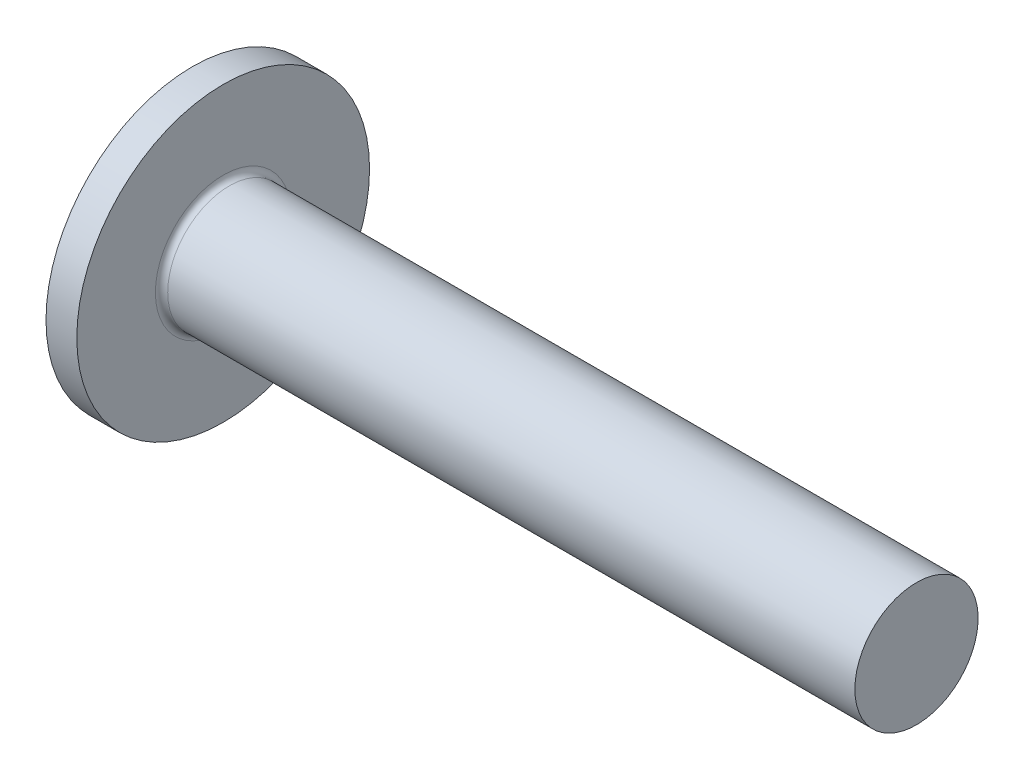
ISO-10303-21;
HEADER;
FILE_DESCRIPTION(('STEP AP214'),'2;1');
FILE_NAME('part.step','',(''),(''),'','','');
FILE_SCHEMA(('AUTOMOTIVE_DESIGN { 1 0 10303 214 1 1 1 1 }'));
ENDSEC;
DATA;
#1=APPLICATION_CONTEXT('core data for automotive mechanical design processes');
#2=APPLICATION_PROTOCOL_DEFINITION('international standard','automotive_design',2000,#1);
#3=PRODUCT_CONTEXT('',#1,'mechanical');
#4=PRODUCT('Part','Part','',(#3));
#5=PRODUCT_RELATED_PRODUCT_CATEGORY('part','',(#4));
#6=PRODUCT_DEFINITION_FORMATION('','',#4);
#7=PRODUCT_DEFINITION_CONTEXT('part definition',#1,'design');
#8=PRODUCT_DEFINITION('design','',#6,#7);
#9=PRODUCT_DEFINITION_SHAPE('','',#8);
#10=(LENGTH_UNIT() NAMED_UNIT(*) SI_UNIT(.MILLI.,.METRE.));
#11=(NAMED_UNIT(*) PLANE_ANGLE_UNIT() SI_UNIT($,.RADIAN.));
#12=(NAMED_UNIT(*) SI_UNIT($,.STERADIAN.) SOLID_ANGLE_UNIT());
#13=UNCERTAINTY_MEASURE_WITH_UNIT(LENGTH_MEASURE(1.E-05),#10,'distance_accuracy_value','');
#14=(GEOMETRIC_REPRESENTATION_CONTEXT(3) GLOBAL_UNCERTAINTY_ASSIGNED_CONTEXT((#13)) GLOBAL_UNIT_ASSIGNED_CONTEXT((#10,
#11,#12)) REPRESENTATION_CONTEXT('',''));
#15=CARTESIAN_POINT('',(0.,0.,0.));
#16=DIRECTION('',(0.,0.,1.));
#17=DIRECTION('',(1.,0.,0.));
#18=AXIS2_PLACEMENT_3D('',#15,#16,#17);
#19=CARTESIAN_POINT('',(4.52,-2.10652468209061,1.08));
#20=DIRECTION('',(0.,0.,1.));
#21=DIRECTION('',(1.,0.,0.));
#22=AXIS2_PLACEMENT_3D('',#19,#20,#21);
#23=PLANE('',#22);
#24=CARTESIAN_POINT('',(-3.42949548135467,-2.24578482291369,1.08));
#25=CARTESIAN_POINT('',(-2.74459757422525,-2.19263025216654,1.08));
#26=CARTESIAN_POINT('',(-2.05972501907199,-2.13914560063199,1.08));
#27=CARTESIAN_POINT('',(-0.690039772323025,-2.03129030940671,1.08));
#28=CARTESIAN_POINT('',(-0.00522708173474084,-1.97691965693136,1.08));
#29=CARTESIAN_POINT('',(1.36430916906305,-1.86706808550733,1.08));
#30=CARTESIAN_POINT('',(2.04903272931446,-1.81158716708237,1.08));
#31=CARTESIAN_POINT('',(3.07602359194152,-1.72726879416334,1.08));
#32=CARTESIAN_POINT('',(3.41833592845816,-1.69898002306805,1.08));
#33=CARTESIAN_POINT('',(4.10292649445159,-1.64197450899678,1.08));
#34=CARTESIAN_POINT('',(4.44520472376341,-1.61325776404309,1.08));
#35=CARTESIAN_POINT('',(5.50891408371535,-1.52324279017826,1.08));
#36=CARTESIAN_POINT('',(6.23027412879058,-1.46109632194497,1.08));
#37=CARTESIAN_POINT('',(7.31209654393642,-1.36548150018966,1.08));
#38=CARTESIAN_POINT('',(7.67266478712463,-1.33321098056209,1.08));
#39=CARTESIAN_POINT('',(8.39371198196685,-1.26767125361173,1.08));
#40=CARTESIAN_POINT('',(8.75419093330816,-1.23440204283998,1.08));
#41=CARTESIAN_POINT('',(9.47506187097177,-1.16659796049542,1.08));
#42=CARTESIAN_POINT('',(9.83545384698853,-1.13206297896843,1.08));
#43=CARTESIAN_POINT('',(10.5560726847527,-1.06134119052349,1.08));
#44=CARTESIAN_POINT('',(10.9162995480562,-1.02515439950972,1.08));
#45=CARTESIAN_POINT('',(11.6365460591403,-0.950537108981323,1.08));
#46=CARTESIAN_POINT('',(11.9965656924728,-0.912106468577752,1.08));
#47=CARTESIAN_POINT('',(12.536330571586,-0.852024599868948,1.08));
#48=CARTESIAN_POINT('',(12.7162110046236,-0.831590976075893,1.08));
#49=CARTESIAN_POINT('',(13.075853395867,-0.789691757116592,1.08));
#50=CARTESIAN_POINT('',(13.2556153527738,-0.768226150820763,1.08));
#51=CARTESIAN_POINT('',(13.4353019596236,-0.746134687566356,1.08));
#52=B_SPLINE_CURVE_WITH_KNOTS('',3,(#24,#25,#26,#27,#28,#29,#30,#31,#32,#33,#34,#35,#36,#37,#38,
#39,#40,#41,#42,#43,#44,#45,#46,#47,#48,#49,#50,#51),.UNSPECIFIED.,.F.,.F.,(4,2,2,2,2,2,2,2,2,2,
2,2,2,4),(0.,2.06087268026439,4.12177512442803,6.18267659645409,7.21311405722568,
8.24355628122954,10.4156465560909,11.5016738987954,12.5877049925156,13.673830651548,
14.7599458552026,15.8461293283809,16.3892386009247,16.9323537320328),.UNSPECIFIED.);
#53=CARTESIAN_POINT('',(4.52,-1.60687912990707,1.08));
#54=VERTEX_POINT('',#53);
#55=CARTESIAN_POINT('',(0.229677597310556,-1.95799778910139,1.08));
#56=VERTEX_POINT('',#55);
#57=EDGE_CURVE('E332',#54,#56,#52,.F.);
#58=ORIENTED_EDGE('',*,*,#57,.F.);
#59=DIRECTION('',(0.,1.,0.));
#60=VECTOR('',#59,1.);
#61=CARTESIAN_POINT('',(4.52,-2.10652468209061,1.08));
#62=LINE('',#61,#60);
#63=CARTESIAN_POINT('',(4.52,-2.10652468209061,1.08));
#64=VERTEX_POINT('',#63);
#65=EDGE_CURVE('E291',#64,#54,#62,.T.);
#66=ORIENTED_EDGE('',*,*,#65,.F.);
#67=DIRECTION('',(0.891769790724579,0.452489381478771,0.));
#68=VECTOR('',#67,1.);
#69=CARTESIAN_POINT('',(0.,-4.4,1.08));
#70=LINE('',#69,#68);
#71=CARTESIAN_POINT('',(0.806505873038805,-3.9907740456718,1.08));
#72=VERTEX_POINT('',#71);
#73=EDGE_CURVE('E277',#72,#64,#70,.T.);
#74=ORIENTED_EDGE('',*,*,#73,.F.);
#75=CARTESIAN_POINT('',(11.,0.,1.08));
#76=DIRECTION('',(0.,0.,1.));
#77=DIRECTION('',(1.,0.,0.));
#78=AXIS2_PLACEMENT_3D('',#75,#76,#77);
#79=CIRCLE('',#78,10.9468534291823);
#80=EDGE_CURVE('E214',#56,#72,#79,.T.);
#81=ORIENTED_EDGE('',*,*,#80,.F.);
#82=EDGE_LOOP('',(#58,#66,#74,#81));
#83=FACE_BOUND('',#82,.T.);
#84=ADVANCED_FACE('F39',(#83),#23,.F.);
#85=CARTESIAN_POINT('',(4.52,2.106524682091,-1.08));
#86=DIRECTION('',(0.,0.,-1.));
#87=DIRECTION('',(0.,1.,0.));
#88=AXIS2_PLACEMENT_3D('',#85,#86,#87);
#89=PLANE('',#88);
#90=CARTESIAN_POINT('',(-3.42949548898096,-2.24578482350543,-1.08));
#91=CARTESIAN_POINT('',(-2.74459758090029,-2.19263025268705,-1.08));
#92=CARTESIAN_POINT('',(-2.05972502479582,-2.13914560108067,-1.08));
#93=CARTESIAN_POINT('',(-0.690039776144523,-2.03129030970972,-1.08));
#94=CARTESIAN_POINT('',(-0.00522708460510993,-1.97691965716053,-1.08));
#95=CARTESIAN_POINT('',(1.36430916876932,-1.86706808553195,-1.08));
#96=CARTESIAN_POINT('',(2.04903273064614,-1.81158716697517,-1.08));
#97=CARTESIAN_POINT('',(3.07602359571083,-1.7272687938528,-1.08));
#98=CARTESIAN_POINT('',(3.41833593303991,-1.69898002268879,-1.08));
#99=CARTESIAN_POINT('',(4.10292650065803,-1.64197450847772,-1.08));
#100=CARTESIAN_POINT('',(4.44520473078209,-1.61325776345294,-1.08));
#101=CARTESIAN_POINT('',(5.50891409154568,-1.5232427895075,-1.08));
#102=CARTESIAN_POINT('',(6.23027413662032,-1.4610963212648,-1.08));
#103=CARTESIAN_POINT('',(7.31209655176489,-1.36548149949189,-1.08));
#104=CARTESIAN_POINT('',(7.67266479495259,-1.33321097985786,-1.08));
#105=CARTESIAN_POINT('',(8.39371198979364,-1.26767125289298,-1.08));
#106=CARTESIAN_POINT('',(8.75419094113428,-1.23440204211315,-1.08));
#107=CARTESIAN_POINT('',(9.47506187879645,-1.16659795975014,-1.08));
#108=CARTESIAN_POINT('',(9.83545385481244,-1.13206297821277,-1.08));
#109=CARTESIAN_POINT('',(10.5560726925747,-1.06134118974365,-1.08));
#110=CARTESIAN_POINT('',(10.916299555877,-1.02515439871608,-1.08));
#111=CARTESIAN_POINT('',(11.6365460669582,-0.950537108154692,-1.08));
#112=CARTESIAN_POINT('',(11.996565700289,-0.91210646773193,-1.08));
#113=CARTESIAN_POINT('',(12.5363305793987,-0.852024598987238,-1.08));
#114=CARTESIAN_POINT('',(12.716211012435,-0.831590975181036,-1.08));
#115=CARTESIAN_POINT('',(13.0758534036753,-0.789691756191974,-1.08));
#116=CARTESIAN_POINT('',(13.2556153605804,-0.768226149879534,-1.08));
#117=CARTESIAN_POINT('',(13.4353019674281,-0.746134686606234,-1.08));
#118=B_SPLINE_CURVE_WITH_KNOTS('',3,(#90,#91,#92,#93,#94,#95,#96,#97,#98,#99,#100,#101,#102,
#103,#104,#105,#106,#107,#108,#109,#110,#111,#112,#113,#114,#115,#116,#117),.UNSPECIFIED.,.F.,
.F.,(4,2,2,2,2,2,2,2,2,2,2,2,2,4),(0.,2.06087268312612,4.12177513015173,6.18267660707004,
7.21311407028764,8.24355629673754,10.4156465715995,11.5016739143043,12.5877050080247,
13.6738306670577,14.759945870713,15.8461293438922,16.3892386164365,16.9323537475453),.UNSPECIFIED.);
#119=CARTESIAN_POINT('',(0.229677597310245,-1.95799778910142,-1.08));
#120=VERTEX_POINT('',#119);
#121=CARTESIAN_POINT('',(4.52,-1.60687912990707,-1.08));
#122=VERTEX_POINT('',#121);
#123=EDGE_CURVE('E324',#120,#122,#118,.T.);
#124=ORIENTED_EDGE('',*,*,#123,.F.);
#125=CARTESIAN_POINT('',(11.,0.,-1.08));
#126=DIRECTION('',(0.,0.,-1.));
#127=DIRECTION('',(0.,1.,0.));
#128=AXIS2_PLACEMENT_3D('',#125,#126,#127);
#129=CIRCLE('',#128,10.9468534291823);
#130=CARTESIAN_POINT('',(0.806505873038805,-3.9907740456718,-1.08));
#131=VERTEX_POINT('',#130);
#132=EDGE_CURVE('E219',#131,#120,#129,.T.);
#133=ORIENTED_EDGE('',*,*,#132,.F.);
#134=DIRECTION('',(0.891769790724579,0.452489381478771,0.));
#135=VECTOR('',#134,1.);
#136=CARTESIAN_POINT('',(0.,-4.4,-1.08));
#137=LINE('',#136,#135);
#138=CARTESIAN_POINT('',(4.52,-2.10652468209061,-1.08));
#139=VERTEX_POINT('',#138);
#140=EDGE_CURVE('E280',#131,#139,#137,.T.);
#141=ORIENTED_EDGE('',*,*,#140,.T.);
#142=DIRECTION('',(0.,-1.,0.));
#143=VECTOR('',#142,1.);
#144=CARTESIAN_POINT('',(4.52,2.106524682091,-1.08));
#145=LINE('',#144,#143);
#146=EDGE_CURVE('E290',#122,#139,#145,.T.);
#147=ORIENTED_EDGE('',*,*,#146,.F.);
#148=EDGE_LOOP('',(#124,#133,#141,#147));
#149=FACE_BOUND('',#148,.T.);
#150=ADVANCED_FACE('F172',(#149),#89,.F.);
#151=CARTESIAN_POINT('',(11.,0.,0.));
#152=DIRECTION('',(-1.,0.,0.));
#153=DIRECTION('',(0.,1.,0.));
#154=AXIS2_PLACEMENT_3D('',#151,#152,#153);
#155=SPHERICAL_SURFACE('',#154,11.);
#156=CARTESIAN_POINT('',(3.9,0.,0.));
#157=DIRECTION('',(1.,0.,0.));
#158=DIRECTION('',(0.,0.,-1.));
#159=AXIS2_PLACEMENT_3D('',#156,#157,#158);
#160=CIRCLE('',#159,8.40178552451799);
#161=CARTESIAN_POINT('',(3.9,0.,-8.40178552451799));
#162=VERTEX_POINT('',#161);
#163=EDGE_CURVE('E313',#162,#162,#160,.F.);
#164=ORIENTED_EDGE('',*,*,#163,.T.);
#165=EDGE_LOOP('',(#164));
#166=FACE_BOUND('',#165,.T.);
#167=CARTESIAN_POINT('',(0.229677597310556,0.,0.));
#168=DIRECTION('',(1.,0.,0.));
#169=DIRECTION('',(0.,0.,-1.));
#170=AXIS2_PLACEMENT_3D('',#167,#168,#169);
#171=CIRCLE('',#170,2.23610271278534);
#172=CARTESIAN_POINT('',(0.229677597310556,-1.07999999999999,-1.95799778910139));
#173=VERTEX_POINT('',#172);
#174=EDGE_CURVE('E318',#173,#120,#171,.F.);
#175=ORIENTED_EDGE('',*,*,#174,.F.);
#176=CARTESIAN_POINT('',(11.,-1.08,0.));
#177=DIRECTION('',(0.,-1.,0.));
#178=DIRECTION('',(0.,0.,-1.));
#179=AXIS2_PLACEMENT_3D('',#176,#177,#178);
#180=CIRCLE('',#179,10.9468534291823);
#181=CARTESIAN_POINT('',(0.806505873038805,-1.07999999999999,-3.9907740456718));
#182=VERTEX_POINT('',#181);
#183=EDGE_CURVE('E230',#173,#182,#180,.T.);
#184=ORIENTED_EDGE('',*,*,#183,.T.);
#185=CARTESIAN_POINT('',(10.5232589446548,0.,0.939565188835178));
#186=DIRECTION('',(0.452489381478771,0.,-0.891769790724579));
#187=DIRECTION('',(-0.891769790724579,0.,-0.452489381478771));
#188=AXIS2_PLACEMENT_3D('',#185,#186,#187);
#189=CIRCLE('',#188,10.9494262508169);
#190=CARTESIAN_POINT('',(0.806505873038805,1.08000000000001,-3.9907740456718));
#191=VERTEX_POINT('',#190);
#192=EDGE_CURVE('E53',#182,#191,#189,.T.);
#193=ORIENTED_EDGE('',*,*,#192,.T.);
#194=CARTESIAN_POINT('',(11.,1.08,0.));
#195=DIRECTION('',(0.,1.,0.));
#196=DIRECTION('',(0.,0.,1.));
#197=AXIS2_PLACEMENT_3D('',#194,#195,#196);
#198=CIRCLE('',#197,10.9468534291823);
#199=CARTESIAN_POINT('',(0.229677597310556,1.08000000000001,-1.95799778910138));
#200=VERTEX_POINT('',#199);
#201=EDGE_CURVE('E228',#191,#200,#198,.T.);
#202=ORIENTED_EDGE('',*,*,#201,.T.);
#203=CARTESIAN_POINT('',(0.229677597310559,1.9579977891014,-1.08));
#204=VERTEX_POINT('',#203);
#205=EDGE_CURVE('E339',#204,#200,#171,.F.);
#206=ORIENTED_EDGE('',*,*,#205,.F.);
#207=CARTESIAN_POINT('',(0.806505873038829,3.99077404567186,-1.08));
#208=VERTEX_POINT('',#207);
#209=EDGE_CURVE('E315',#204,#208,#129,.T.);
#210=ORIENTED_EDGE('',*,*,#209,.T.);
#211=CARTESIAN_POINT('',(10.5232589446552,-0.939565188834484,0.));
#212=DIRECTION('',(0.45248938147871,0.89176979072461,0.));
#213=DIRECTION('',(-0.89176979072461,0.45248938147871,0.));
#214=AXIS2_PLACEMENT_3D('',#211,#212,#213);
#215=CIRCLE('',#214,10.9494262508169);
#216=CARTESIAN_POINT('',(0.806505873038829,3.99077404567186,1.08));
#217=VERTEX_POINT('',#216);
#218=EDGE_CURVE('E212',#208,#217,#215,.T.);
#219=ORIENTED_EDGE('',*,*,#218,.T.);
#220=CARTESIAN_POINT('',(0.229677597310556,1.95799778910139,1.08));
#221=VERTEX_POINT('',#220);
#222=EDGE_CURVE('E200',#217,#221,#79,.T.);
#223=ORIENTED_EDGE('',*,*,#222,.T.);
#224=CARTESIAN_POINT('',(0.229677597310559,1.07999999999999,1.9579977891014));
#225=VERTEX_POINT('',#224);
#226=EDGE_CURVE('E210',#225,#221,#171,.F.);
#227=ORIENTED_EDGE('',*,*,#226,.F.);
#228=CARTESIAN_POINT('',(0.806505873038829,1.07999999999999,3.99077404567186));
#229=VERTEX_POINT('',#228);
#230=EDGE_CURVE('E247',#225,#229,#198,.T.);
#231=ORIENTED_EDGE('',*,*,#230,.T.);
#232=CARTESIAN_POINT('',(10.5232589446552,0.,-0.939565188834484));
#233=DIRECTION('',(0.45248938147871,0.,0.89176979072461));
#234=DIRECTION('',(0.89176979072461,0.,-0.45248938147871));
#235=AXIS2_PLACEMENT_3D('',#232,#233,#234);
#236=CIRCLE('',#235,10.9494262508169);
#237=CARTESIAN_POINT('',(0.806505873038829,-1.08000000000001,3.99077404567185));
#238=VERTEX_POINT('',#237);
#239=EDGE_CURVE('E217',#229,#238,#236,.T.);
#240=ORIENTED_EDGE('',*,*,#239,.T.);
#241=CARTESIAN_POINT('',(0.229677597310245,-1.08000000000001,1.95799778910142));
#242=VERTEX_POINT('',#241);
#243=EDGE_CURVE('E276',#238,#242,#180,.T.);
#244=ORIENTED_EDGE('',*,*,#243,.T.);
#245=EDGE_CURVE('E204',#56,#242,#171,.F.);
#246=ORIENTED_EDGE('',*,*,#245,.F.);
#247=ORIENTED_EDGE('',*,*,#80,.T.);
#248=CARTESIAN_POINT('',(10.5232589446548,0.939565188835178,0.));
#249=DIRECTION('',(0.452489381478771,-0.891769790724579,0.));
#250=DIRECTION('',(0.891769790724579,0.452489381478771,0.));
#251=AXIS2_PLACEMENT_3D('',#248,#249,#250);
#252=CIRCLE('',#251,10.9494262508169);
#253=EDGE_CURVE('E213',#72,#131,#252,.T.);
#254=ORIENTED_EDGE('',*,*,#253,.T.);
#255=ORIENTED_EDGE('',*,*,#132,.T.);
#256=EDGE_LOOP('',(#175,#184,#193,#202,#206,#210,#219,#223,#227,#231,#240,#244,#246,#247,#254,#255));
#257=FACE_BOUND('',#256,.T.);
#258=ADVANCED_FACE('F179',(#166,#257),#155,.T.);
#259=CARTESIAN_POINT('',(-3.42949548135467,2.24578482291369,1.08));
#260=CARTESIAN_POINT('',(-2.74459757422525,2.19263025216654,1.08));
#261=CARTESIAN_POINT('',(-2.05972501907199,2.13914560063199,1.08));
#262=CARTESIAN_POINT('',(-0.690039772323024,2.03129030940671,1.08));
#263=CARTESIAN_POINT('',(-0.0052270817347403,1.97691965693136,1.08));
#264=CARTESIAN_POINT('',(1.36430916906305,1.86706808550733,1.08));
#265=CARTESIAN_POINT('',(2.04903272931446,1.81158716708237,1.08));
#266=CARTESIAN_POINT('',(3.07602359194152,1.72726879416334,1.08));
#267=CARTESIAN_POINT('',(3.41833592845816,1.69898002306805,1.08));
#268=CARTESIAN_POINT('',(4.10292649445159,1.64197450899678,1.08));
#269=CARTESIAN_POINT('',(4.44520472376341,1.61325776404309,1.08));
#270=CARTESIAN_POINT('',(5.50891408371535,1.52324279017826,1.08));
#271=CARTESIAN_POINT('',(6.23027412879058,1.46109632194497,1.08));
#272=CARTESIAN_POINT('',(7.31209654393642,1.36548150018966,1.08));
#273=CARTESIAN_POINT('',(7.67266478712463,1.33321098056209,1.08));
#274=CARTESIAN_POINT('',(8.39371198196685,1.26767125361173,1.08));
#275=CARTESIAN_POINT('',(8.75419093330816,1.23440204283998,1.08));
#276=CARTESIAN_POINT('',(9.47506187097177,1.16659796049542,1.08));
#277=CARTESIAN_POINT('',(9.83545384698853,1.13206297896843,1.08));
#278=CARTESIAN_POINT('',(10.5560726847527,1.06134119052349,1.08));
#279=CARTESIAN_POINT('',(10.9162995480562,1.02515439950972,1.08));
#280=CARTESIAN_POINT('',(11.6365460591403,0.950537108981323,1.08));
#281=CARTESIAN_POINT('',(11.9965656924729,0.912106468577753,1.08));
#282=CARTESIAN_POINT('',(12.536330571586,0.852024599868948,1.08));
#283=CARTESIAN_POINT('',(12.7162110046236,0.831590976075893,1.08));
#284=CARTESIAN_POINT('',(13.075853395867,0.789691757116591,1.08));
#285=CARTESIAN_POINT('',(13.2556153527738,0.768226150820763,1.08));
#286=CARTESIAN_POINT('',(13.4353019596236,0.746134687566355,1.08));
#287=B_SPLINE_CURVE_WITH_KNOTS('',3,(#259,#260,#261,#262,#263,#264,#265,#266,#267,#268,#269,
#270,#271,#272,#273,#274,#275,#276,#277,#278,#279,#280,#281,#282,#283,#284,#285,#286),
.UNSPECIFIED.,.F.,.F.,(4,2,2,2,2,2,2,2,2,2,2,2,2,4),(0.,2.06087268026439,4.12177512442803,
6.18267659645409,7.21311405722568,8.24355628122954,10.4156465560909,11.5016738987954,
12.5877049925156,13.673830651548,14.7599458552026,15.8461293283809,16.3892386009247,
16.9323537320328),.UNSPECIFIED.);
#288=CARTESIAN_POINT('',(4.52,1.60687912990707,1.08));
#289=VERTEX_POINT('',#288);
#290=EDGE_CURVE('E198',#221,#289,#287,.T.);
#291=ORIENTED_EDGE('',*,*,#290,.F.);
#292=ORIENTED_EDGE('',*,*,#222,.F.);
#293=DIRECTION('',(0.89176979072461,-0.45248938147871,0.));
#294=VECTOR('',#293,1.);
#295=CARTESIAN_POINT('',(0.,4.4,1.08));
#296=LINE('',#295,#294);
#297=CARTESIAN_POINT('',(4.52,2.106524682091,1.08));
#298=VERTEX_POINT('',#297);
#299=EDGE_CURVE('E67',#217,#298,#296,.T.);
#300=ORIENTED_EDGE('',*,*,#299,.T.);
#301=EDGE_CURVE('E202',#289,#298,#62,.T.);
#302=ORIENTED_EDGE('',*,*,#301,.F.);
#303=EDGE_LOOP('',(#291,#292,#300,#302));
#304=FACE_BOUND('',#303,.T.);
#305=ADVANCED_FACE('F175',(#304),#23,.F.);
#306=CARTESIAN_POINT('',(-3.42949548898096,2.24578482350543,-1.08));
#307=CARTESIAN_POINT('',(-2.74459758090029,2.19263025268706,-1.08));
#308=CARTESIAN_POINT('',(-2.05972502479582,2.13914560108067,-1.08));
#309=CARTESIAN_POINT('',(-0.690039776144522,2.03129030970972,-1.08));
#310=CARTESIAN_POINT('',(-0.00522708460510939,1.97691965716054,-1.08));
#311=CARTESIAN_POINT('',(1.36430916876932,1.86706808553195,-1.08));
#312=CARTESIAN_POINT('',(2.04903273064614,1.81158716697518,-1.08));
#313=CARTESIAN_POINT('',(3.07602359571083,1.7272687938528,-1.08));
#314=CARTESIAN_POINT('',(3.41833593303991,1.69898002268879,-1.08));
#315=CARTESIAN_POINT('',(4.10292650065803,1.64197450847772,-1.08));
#316=CARTESIAN_POINT('',(4.4452047307821,1.61325776345294,-1.08));
#317=CARTESIAN_POINT('',(5.50891409154568,1.5232427895075,-1.08));
#318=CARTESIAN_POINT('',(6.23027413662032,1.4610963212648,-1.08));
#319=CARTESIAN_POINT('',(7.31209655176489,1.36548149949189,-1.08));
#320=CARTESIAN_POINT('',(7.67266479495259,1.33321097985786,-1.08));
#321=CARTESIAN_POINT('',(8.39371198979364,1.26767125289298,-1.08));
#322=CARTESIAN_POINT('',(8.75419094113429,1.23440204211315,-1.08));
#323=CARTESIAN_POINT('',(9.47506187879645,1.16659795975014,-1.08));
#324=CARTESIAN_POINT('',(9.83545385481244,1.13206297821277,-1.08));
#325=CARTESIAN_POINT('',(10.5560726925747,1.06134118974365,-1.08));
#326=CARTESIAN_POINT('',(10.916299555877,1.02515439871608,-1.08));
#327=CARTESIAN_POINT('',(11.6365460669582,0.950537108154692,-1.08));
#328=CARTESIAN_POINT('',(11.996565700289,0.91210646773193,-1.08));
#329=CARTESIAN_POINT('',(12.5363305793987,0.852024598987239,-1.08));
#330=CARTESIAN_POINT('',(12.716211012435,0.831590975181037,-1.08));
#331=CARTESIAN_POINT('',(13.0758534036753,0.789691756191976,-1.08));
#332=CARTESIAN_POINT('',(13.2556153605804,0.768226149879535,-1.08));
#333=CARTESIAN_POINT('',(13.4353019674281,0.746134686606234,-1.08));
#334=B_SPLINE_CURVE_WITH_KNOTS('',3,(#306,#307,#308,#309,#310,#311,#312,#313,#314,#315,#316,
#317,#318,#319,#320,#321,#322,#323,#324,#325,#326,#327,#328,#329,#330,#331,#332,#333),
.UNSPECIFIED.,.F.,.F.,(4,2,2,2,2,2,2,2,2,2,2,2,2,4),(0.,2.06087268312612,4.12177513015173,
6.18267660707004,7.21311407028764,8.24355629673754,10.4156465715996,11.5016739143043,
12.5877050080247,13.6738306670577,14.759945870713,15.8461293438922,16.3892386164365,
16.9323537475453),.UNSPECIFIED.);
#335=CARTESIAN_POINT('',(4.52,1.60687912990707,-1.08));
#336=VERTEX_POINT('',#335);
#337=EDGE_CURVE('E350',#336,#204,#334,.F.);
#338=ORIENTED_EDGE('',*,*,#337,.F.);
#339=CARTESIAN_POINT('',(4.52,2.106524682091,-1.08));
#340=VERTEX_POINT('',#339);
#341=EDGE_CURVE('E292',#340,#336,#145,.T.);
#342=ORIENTED_EDGE('',*,*,#341,.F.);
#343=DIRECTION('',(0.89176979072461,-0.45248938147871,0.));
#344=VECTOR('',#343,1.);
#345=CARTESIAN_POINT('',(0.,4.4,-1.08));
#346=LINE('',#345,#344);
#347=EDGE_CURVE('E284',#208,#340,#346,.T.);
#348=ORIENTED_EDGE('',*,*,#347,.F.);
#349=ORIENTED_EDGE('',*,*,#209,.F.);
#350=EDGE_LOOP('',(#338,#342,#348,#349));
#351=FACE_BOUND('',#350,.T.);
#352=ADVANCED_FACE('F182',(#351),#89,.F.);
#353=CARTESIAN_POINT('',(4.52,2.106524682091,1.08));
#354=DIRECTION('',(-1.,0.,0.));
#355=DIRECTION('',(0.,0.,1.));
#356=AXIS2_PLACEMENT_3D('',#353,#354,#355);
#357=PLANE('',#356);
#358=ORIENTED_EDGE('',*,*,#65,.T.);
#359=CARTESIAN_POINT('',(4.52,0.,0.));
#360=DIRECTION('',(-1.,0.,0.));
#361=DIRECTION('',(0.,0.,1.));
#362=AXIS2_PLACEMENT_3D('',#359,#360,#361);
#363=CIRCLE('',#362,1.93609414495548);
#364=EDGE_CURVE('E336',#54,#122,#363,.F.);
#365=ORIENTED_EDGE('',*,*,#364,.T.);
#366=ORIENTED_EDGE('',*,*,#146,.T.);
#367=DIRECTION('',(0.,0.,1.));
#368=VECTOR('',#367,1.);
#369=CARTESIAN_POINT('',(4.52,-2.10652468209061,-1.08));
#370=LINE('',#369,#368);
#371=EDGE_CURVE('E286',#139,#64,#370,.T.);
#372=ORIENTED_EDGE('',*,*,#371,.T.);
#373=EDGE_LOOP('',(#358,#365,#366,#372));
#374=FACE_BOUND('',#373,.T.);
#375=ADVANCED_FACE('F192',(#374),#357,.T.);
#376=DIRECTION('',(0.,0.,1.));
#377=VECTOR('',#376,1.);
#378=CARTESIAN_POINT('',(4.52,-1.07999999999999,-2.10652468209061));
#379=LINE('',#378,#377);
#380=CARTESIAN_POINT('',(4.52,-1.07999999999999,-2.10652468209061));
#381=VERTEX_POINT('',#380);
#382=CARTESIAN_POINT('',(4.52,-1.07999999999999,-1.60687912990707));
#383=VERTEX_POINT('',#382);
#384=EDGE_CURVE('E245',#381,#383,#379,.T.);
#385=ORIENTED_EDGE('',*,*,#384,.T.);
#386=CARTESIAN_POINT('',(4.52,1.08000000000001,-1.60687912990706));
#387=VERTEX_POINT('',#386);
#388=EDGE_CURVE('E378',#383,#387,#363,.F.);
#389=ORIENTED_EDGE('',*,*,#388,.T.);
#390=DIRECTION('',(0.,0.,-1.));
#391=VECTOR('',#390,1.);
#392=CARTESIAN_POINT('',(4.52,1.07999999999999,2.106524682091));
#393=LINE('',#392,#391);
#394=CARTESIAN_POINT('',(4.52,1.08000000000001,-2.1065246820906));
#395=VERTEX_POINT('',#394);
#396=EDGE_CURVE('E268',#387,#395,#393,.T.);
#397=ORIENTED_EDGE('',*,*,#396,.T.);
#398=DIRECTION('',(0.,-1.,0.));
#399=VECTOR('',#398,1.);
#400=CARTESIAN_POINT('',(4.52,1.08000000000001,-2.1065246820906));
#401=LINE('',#400,#399);
#402=EDGE_CURVE('E264',#395,#381,#401,.T.);
#403=ORIENTED_EDGE('',*,*,#402,.T.);
#404=EDGE_LOOP('',(#385,#389,#397,#403));
#405=FACE_BOUND('',#404,.T.);
#406=ADVANCED_FACE('F459',(#405),#357,.T.);
#407=ORIENTED_EDGE('',*,*,#341,.T.);
#408=EDGE_CURVE('E334',#336,#289,#363,.F.);
#409=ORIENTED_EDGE('',*,*,#408,.T.);
#410=ORIENTED_EDGE('',*,*,#301,.T.);
#411=DIRECTION('',(0.,0.,-1.));
#412=VECTOR('',#411,1.);
#413=CARTESIAN_POINT('',(4.52,2.106524682091,1.08));
#414=LINE('',#413,#412);
#415=EDGE_CURVE('E287',#298,#340,#414,.T.);
#416=ORIENTED_EDGE('',*,*,#415,.T.);
#417=EDGE_LOOP('',(#407,#409,#410,#416));
#418=FACE_BOUND('',#417,.T.);
#419=ADVANCED_FACE('F383',(#418),#357,.T.);
#420=CARTESIAN_POINT('',(4.52,1.07999999999999,2.106524682091));
#421=DIRECTION('',(0.,1.,0.));
#422=DIRECTION('',(0.,0.,1.));
#423=AXIS2_PLACEMENT_3D('',#420,#421,#422);
#424=PLANE('',#423);
#425=CARTESIAN_POINT('',(-3.42949548898096,1.08000000000001,-2.24578482350543));
#426=CARTESIAN_POINT('',(-2.74459758090029,1.08000000000001,-2.19263025268705));
#427=CARTESIAN_POINT('',(-2.05972502479583,1.08000000000001,-2.13914560108066));
#428=CARTESIAN_POINT('',(-0.690039776144523,1.08000000000001,-2.03129030970971));
#429=CARTESIAN_POINT('',(-0.00522708460511025,1.08000000000001,-1.97691965716053));
#430=CARTESIAN_POINT('',(1.36430916876932,1.08000000000001,-1.86706808553194));
#431=CARTESIAN_POINT('',(2.04903273064614,1.08000000000001,-1.81158716697517));
#432=CARTESIAN_POINT('',(3.07602359571083,1.08000000000001,-1.72726879385279));
#433=CARTESIAN_POINT('',(3.41833593303991,1.08000000000001,-1.69898002268879));
#434=CARTESIAN_POINT('',(4.10292650065803,1.08000000000001,-1.64197450847772));
#435=CARTESIAN_POINT('',(4.44520473078209,1.08000000000001,-1.61325776345294));
#436=CARTESIAN_POINT('',(5.50891409154568,1.08000000000001,-1.52324278950749));
#437=CARTESIAN_POINT('',(6.23027413662032,1.08000000000001,-1.4610963212648));
#438=CARTESIAN_POINT('',(7.31209655176489,1.08000000000001,-1.36548149949188));
#439=CARTESIAN_POINT('',(7.67266479495259,1.08000000000001,-1.33321097985786));
#440=CARTESIAN_POINT('',(8.39371198979364,1.08,-1.26767125289298));
#441=CARTESIAN_POINT('',(8.75419094113429,1.08,-1.23440204211315));
#442=CARTESIAN_POINT('',(9.47506187879645,1.08,-1.16659795975014));
#443=CARTESIAN_POINT('',(9.83545385481244,1.08,-1.13206297821276));
#444=CARTESIAN_POINT('',(10.5560726925747,1.08,-1.06134118974364));
#445=CARTESIAN_POINT('',(10.916299555877,1.08,-1.02515439871607));
#446=CARTESIAN_POINT('',(11.6365460669582,1.08,-0.950537108154688));
#447=CARTESIAN_POINT('',(11.996565700289,1.08,-0.912106467731926));
#448=CARTESIAN_POINT('',(12.5363305793987,1.08,-0.852024598987235));
#449=CARTESIAN_POINT('',(12.716211012435,1.08,-0.831590975181032));
#450=CARTESIAN_POINT('',(13.0758534036753,1.08,-0.789691756191971));
#451=CARTESIAN_POINT('',(13.2556153605804,1.08,-0.76822614987953));
#452=CARTESIAN_POINT('',(13.4353019674281,1.08,-0.74613468660623));
#453=B_SPLINE_CURVE_WITH_KNOTS('',3,(#425,#426,#427,#428,#429,#430,#431,#432,#433,#434,#435,
#436,#437,#438,#439,#440,#441,#442,#443,#444,#445,#446,#447,#448,#449,#450,#451,#452),
.UNSPECIFIED.,.F.,.F.,(4,2,2,2,2,2,2,2,2,2,2,2,2,4),(0.,2.06087268312612,4.12177513015173,
6.18267660707004,7.21311407028764,8.24355629673754,10.4156465715996,11.5016739143043,
12.5877050080247,13.6738306670577,14.759945870713,15.8461293438922,16.3892386164365,
16.9323537475453),.UNSPECIFIED.);
#454=EDGE_CURVE('E373',#200,#387,#453,.T.);
#455=ORIENTED_EDGE('',*,*,#454,.F.);
#456=ORIENTED_EDGE('',*,*,#201,.F.);
#457=DIRECTION('',(0.891769790724579,0.,0.452489381478771));
#458=VECTOR('',#457,1.);
#459=CARTESIAN_POINT('',(0.,1.08000000000002,-4.4));
#460=LINE('',#459,#458);
#461=EDGE_CURVE('E239',#191,#395,#460,.T.);
#462=ORIENTED_EDGE('',*,*,#461,.T.);
#463=ORIENTED_EDGE('',*,*,#396,.F.);
#464=EDGE_LOOP('',(#455,#456,#462,#463));
#465=FACE_BOUND('',#464,.T.);
#466=ADVANCED_FACE('F379',(#465),#424,.F.);
#467=CARTESIAN_POINT('',(4.52,-1.07999999999999,-2.10652468209061));
#468=DIRECTION('',(0.,-1.,0.));
#469=DIRECTION('',(1.,0.,0.));
#470=AXIS2_PLACEMENT_3D('',#467,#468,#469);
#471=PLANE('',#470);
#472=CARTESIAN_POINT('',(-3.42949548135467,-1.07999999999999,-2.24578482291369));
#473=CARTESIAN_POINT('',(-2.74459757422525,-1.07999999999999,-2.19263025216654));
#474=CARTESIAN_POINT('',(-2.05972501907199,-1.07999999999999,-2.13914560063199));
#475=CARTESIAN_POINT('',(-0.690039772323025,-1.07999999999999,-2.03129030940671));
#476=CARTESIAN_POINT('',(-0.00522708173474106,-1.07999999999999,-1.97691965693137));
#477=CARTESIAN_POINT('',(1.36430916906305,-1.07999999999999,-1.86706808550733));
#478=CARTESIAN_POINT('',(2.04903272931446,-1.07999999999999,-1.81158716708237));
#479=CARTESIAN_POINT('',(3.07602359194152,-1.07999999999999,-1.72726879416334));
#480=CARTESIAN_POINT('',(3.41833592845816,-1.07999999999999,-1.69898002306805));
#481=CARTESIAN_POINT('',(4.10292649445159,-1.07999999999999,-1.64197450899679));
#482=CARTESIAN_POINT('',(4.44520472376341,-1.07999999999999,-1.61325776404309));
#483=CARTESIAN_POINT('',(5.50891408371535,-1.07999999999999,-1.52324279017827));
#484=CARTESIAN_POINT('',(6.23027412879058,-1.07999999999999,-1.46109632194497));
#485=CARTESIAN_POINT('',(7.31209654393642,-1.08,-1.36548150018966));
#486=CARTESIAN_POINT('',(7.67266478712463,-1.08,-1.33321098056209));
#487=CARTESIAN_POINT('',(8.39371198196685,-1.08,-1.26767125361173));
#488=CARTESIAN_POINT('',(8.75419093330816,-1.08,-1.23440204283998));
#489=CARTESIAN_POINT('',(9.47506187097176,-1.08,-1.16659796049543));
#490=CARTESIAN_POINT('',(9.83545384698852,-1.08,-1.13206297896843));
#491=CARTESIAN_POINT('',(10.5560726847527,-1.08,-1.0613411905235));
#492=CARTESIAN_POINT('',(10.9162995480562,-1.08,-1.02515439950972));
#493=CARTESIAN_POINT('',(11.6365460591403,-1.08,-0.950537108981327));
#494=CARTESIAN_POINT('',(11.9965656924728,-1.08,-0.912106468577757));
#495=CARTESIAN_POINT('',(12.536330571586,-1.08,-0.852024599868952));
#496=CARTESIAN_POINT('',(12.7162110046236,-1.08,-0.831590976075897));
#497=CARTESIAN_POINT('',(13.075853395867,-1.08,-0.789691757116596));
#498=CARTESIAN_POINT('',(13.2556153527738,-1.08,-0.768226150820768));
#499=CARTESIAN_POINT('',(13.4353019596236,-1.08,-0.74613468756636));
#500=B_SPLINE_CURVE_WITH_KNOTS('',3,(#472,#473,#474,#475,#476,#477,#478,#479,#480,#481,#482,
#483,#484,#485,#486,#487,#488,#489,#490,#491,#492,#493,#494,#495,#496,#497,#498,#499),
.UNSPECIFIED.,.F.,.F.,(4,2,2,2,2,2,2,2,2,2,2,2,2,4),(0.,2.06087268026439,4.12177512442803,
6.18267659645409,7.21311405722568,8.24355628122954,10.4156465560909,11.5016738987954,
12.5877049925156,13.673830651548,14.7599458552026,15.8461293283809,16.3892386009247,
16.9323537320328),.UNSPECIFIED.);
#501=EDGE_CURVE('E252',#383,#173,#500,.F.);
#502=ORIENTED_EDGE('',*,*,#501,.F.);
#503=ORIENTED_EDGE('',*,*,#384,.F.);
#504=DIRECTION('',(0.891769790724579,0.,0.452489381478771));
#505=VECTOR('',#504,1.);
#506=CARTESIAN_POINT('',(0.,-1.07999999999998,-4.4));
#507=LINE('',#506,#505);
#508=EDGE_CURVE('E236',#182,#381,#507,.T.);
#509=ORIENTED_EDGE('',*,*,#508,.F.);
#510=ORIENTED_EDGE('',*,*,#183,.F.);
#511=EDGE_LOOP('',(#502,#503,#509,#510));
#512=FACE_BOUND('',#511,.T.);
#513=ADVANCED_FACE('F243',(#512),#471,.F.);
#514=CARTESIAN_POINT('',(-3.42949548135467,-1.08000000000001,2.24578482291369));
#515=CARTESIAN_POINT('',(-2.74459757422525,-1.08000000000001,2.19263025216654));
#516=CARTESIAN_POINT('',(-2.05972501907199,-1.08000000000001,2.13914560063198));
#517=CARTESIAN_POINT('',(-0.690039772323025,-1.08000000000001,2.0312903094067));
#518=CARTESIAN_POINT('',(-0.00522708173474149,-1.08000000000001,1.97691965693136));
#519=CARTESIAN_POINT('',(1.36430916906305,-1.08000000000001,1.86706808550732));
#520=CARTESIAN_POINT('',(2.04903272931446,-1.08000000000001,1.81158716708237));
#521=CARTESIAN_POINT('',(3.07602359194152,-1.08000000000001,1.72726879416333));
#522=CARTESIAN_POINT('',(3.41833592845816,-1.08000000000001,1.69898002306805));
#523=CARTESIAN_POINT('',(4.10292649445159,-1.08000000000001,1.64197450899678));
#524=CARTESIAN_POINT('',(4.44520472376341,-1.08000000000001,1.61325776404309));
#525=CARTESIAN_POINT('',(5.50891408371535,-1.08000000000001,1.52324279017826));
#526=CARTESIAN_POINT('',(6.23027412879058,-1.08000000000001,1.46109632194496));
#527=CARTESIAN_POINT('',(7.31209654393642,-1.08,1.36548150018966));
#528=CARTESIAN_POINT('',(7.67266478712463,-1.08,1.33321098056208));
#529=CARTESIAN_POINT('',(8.39371198196685,-1.08,1.26767125361173));
#530=CARTESIAN_POINT('',(8.75419093330816,-1.08,1.23440204283998));
#531=CARTESIAN_POINT('',(9.47506187097176,-1.08,1.16659796049542));
#532=CARTESIAN_POINT('',(9.83545384698852,-1.08,1.13206297896843));
#533=CARTESIAN_POINT('',(10.5560726847527,-1.08,1.06134119052349));
#534=CARTESIAN_POINT('',(10.9162995480562,-1.08,1.02515439950972));
#535=CARTESIAN_POINT('',(11.6365460591403,-1.08,0.95053710898132));
#536=CARTESIAN_POINT('',(11.9965656924728,-1.08,0.91210646857775));
#537=CARTESIAN_POINT('',(12.536330571586,-1.08,0.852024599868945));
#538=CARTESIAN_POINT('',(12.7162110046236,-1.08,0.83159097607589));
#539=CARTESIAN_POINT('',(13.075853395867,-1.08,0.789691757116588));
#540=CARTESIAN_POINT('',(13.2556153527738,-1.08,0.76822615082076));
#541=CARTESIAN_POINT('',(13.4353019596236,-1.08,0.746134687566352));
#542=B_SPLINE_CURVE_WITH_KNOTS('',3,(#514,#515,#516,#517,#518,#519,#520,#521,#522,#523,#524,
#525,#526,#527,#528,#529,#530,#531,#532,#533,#534,#535,#536,#537,#538,#539,#540,#541),
.UNSPECIFIED.,.F.,.F.,(4,2,2,2,2,2,2,2,2,2,2,2,2,4),(0.,2.06087268026439,4.12177512442803,
6.18267659645409,7.21311405722568,8.24355628122954,10.4156465560909,11.5016738987954,
12.5877049925156,13.673830651548,14.7599458552026,15.8461293283809,16.3892386009247,
16.9323537320328),.UNSPECIFIED.);
#543=CARTESIAN_POINT('',(4.52,-1.08000000000001,1.60687912990706));
#544=VERTEX_POINT('',#543);
#545=EDGE_CURVE('E205',#242,#544,#542,.T.);
#546=ORIENTED_EDGE('',*,*,#545,.F.);
#547=ORIENTED_EDGE('',*,*,#243,.F.);
#548=DIRECTION('',(0.89176979072461,0.,-0.45248938147871));
#549=VECTOR('',#548,1.);
#550=CARTESIAN_POINT('',(0.,-1.08000000000001,4.4));
#551=LINE('',#550,#549);
#552=CARTESIAN_POINT('',(4.52,-1.08000000000001,2.106524682091));
#553=VERTEX_POINT('',#552);
#554=EDGE_CURVE('E249',#238,#553,#551,.T.);
#555=ORIENTED_EDGE('',*,*,#554,.T.);
#556=EDGE_CURVE('E273',#544,#553,#379,.T.);
#557=ORIENTED_EDGE('',*,*,#556,.F.);
#558=EDGE_LOOP('',(#546,#547,#555,#557));
#559=FACE_BOUND('',#558,.T.);
#560=ADVANCED_FACE('F432',(#559),#471,.F.);
#561=CARTESIAN_POINT('',(-3.42949548898096,1.07999999999999,2.24578482350544));
#562=CARTESIAN_POINT('',(-2.74459758090029,1.07999999999999,2.19263025268706));
#563=CARTESIAN_POINT('',(-2.05972502479582,1.07999999999999,2.13914560108067));
#564=CARTESIAN_POINT('',(-0.690039776144522,1.07999999999999,2.03129030970972));
#565=CARTESIAN_POINT('',(-0.00522708460510939,1.07999999999999,1.97691965716054));
#566=CARTESIAN_POINT('',(1.36430916876932,1.07999999999999,1.86706808553195));
#567=CARTESIAN_POINT('',(2.04903273064614,1.07999999999999,1.81158716697518));
#568=CARTESIAN_POINT('',(3.07602359571083,1.07999999999999,1.7272687938528));
#569=CARTESIAN_POINT('',(3.41833593303991,1.07999999999999,1.6989800226888));
#570=CARTESIAN_POINT('',(4.10292650065803,1.07999999999999,1.64197450847773));
#571=CARTESIAN_POINT('',(4.44520473078209,1.07999999999999,1.61325776345295));
#572=CARTESIAN_POINT('',(5.50891409154568,1.07999999999999,1.5232427895075));
#573=CARTESIAN_POINT('',(6.23027413662032,1.08,1.4610963212648));
#574=CARTESIAN_POINT('',(7.31209655176489,1.08,1.36548149949189));
#575=CARTESIAN_POINT('',(7.67266479495259,1.08,1.33321097985787));
#576=CARTESIAN_POINT('',(8.39371198979364,1.08,1.26767125289299));
#577=CARTESIAN_POINT('',(8.75419094113429,1.08,1.23440204211316));
#578=CARTESIAN_POINT('',(9.47506187879645,1.08,1.16659795975014));
#579=CARTESIAN_POINT('',(9.83545385481244,1.08,1.13206297821277));
#580=CARTESIAN_POINT('',(10.5560726925747,1.08,1.06134118974365));
#581=CARTESIAN_POINT('',(10.916299555877,1.08,1.02515439871608));
#582=CARTESIAN_POINT('',(11.6365460669582,1.08,0.950537108154696));
#583=CARTESIAN_POINT('',(11.996565700289,1.08,0.912106467731933));
#584=CARTESIAN_POINT('',(12.5363305793987,1.08,0.852024598987243));
#585=CARTESIAN_POINT('',(12.716211012435,1.08,0.83159097518104));
#586=CARTESIAN_POINT('',(13.0758534036753,1.08,0.789691756191979));
#587=CARTESIAN_POINT('',(13.2556153605804,1.08,0.768226149879539));
#588=CARTESIAN_POINT('',(13.4353019674281,1.08,0.746134686606238));
#589=B_SPLINE_CURVE_WITH_KNOTS('',3,(#561,#562,#563,#564,#565,#566,#567,#568,#569,#570,#571,
#572,#573,#574,#575,#576,#577,#578,#579,#580,#581,#582,#583,#584,#585,#586,#587,#588),
.UNSPECIFIED.,.F.,.F.,(4,2,2,2,2,2,2,2,2,2,2,2,2,4),(0.,2.06087268312612,4.12177513015173,
6.18267660707004,7.21311407028764,8.24355629673754,10.4156465715996,11.5016739143043,
12.5877050080247,13.6738306670577,14.759945870713,15.8461293438922,16.3892386164365,
16.9323537475453),.UNSPECIFIED.);
#590=CARTESIAN_POINT('',(4.52,1.07999999999999,1.60687912990707));
#591=VERTEX_POINT('',#590);
#592=EDGE_CURVE('E11',#591,#225,#589,.F.);
#593=ORIENTED_EDGE('',*,*,#592,.F.);
#594=CARTESIAN_POINT('',(4.52,1.07999999999999,2.106524682091));
#595=VERTEX_POINT('',#594);
#596=EDGE_CURVE('E269',#595,#591,#393,.T.);
#597=ORIENTED_EDGE('',*,*,#596,.F.);
#598=DIRECTION('',(0.89176979072461,0.,-0.45248938147871));
#599=VECTOR('',#598,1.);
#600=CARTESIAN_POINT('',(0.,1.07999999999998,4.4));
#601=LINE('',#600,#599);
#602=EDGE_CURVE('E262',#229,#595,#601,.T.);
#603=ORIENTED_EDGE('',*,*,#602,.F.);
#604=ORIENTED_EDGE('',*,*,#230,.F.);
#605=EDGE_LOOP('',(#593,#597,#603,#604));
#606=FACE_BOUND('',#605,.T.);
#607=ADVANCED_FACE('F385',(#606),#424,.F.);
#608=CARTESIAN_POINT('',(-6.34999999999999,0.,0.));
#609=DIRECTION('',(-1.,0.,0.));
#610=DIRECTION('',(0.,0.,1.));
#611=AXIS2_PLACEMENT_3D('',#608,#609,#610);
#612=CYLINDRICAL_SURFACE('',#611,4.00000000000001);
#613=CARTESIAN_POINT('',(6.3,0.,0.));
#614=DIRECTION('',(-1.,0.,0.));
#615=DIRECTION('',(0.,0.,1.));
#616=AXIS2_PLACEMENT_3D('',#613,#614,#615);
#617=CIRCLE('',#616,4.00000000000001);
#618=CARTESIAN_POINT('',(6.3,0.,4.00000000000001));
#619=VERTEX_POINT('',#618);
#620=EDGE_CURVE('E310',#619,#619,#617,.F.);
#621=ORIENTED_EDGE('',*,*,#620,.T.);
#622=EDGE_LOOP('',(#621));
#623=FACE_BOUND('',#622,.T.);
#624=CARTESIAN_POINT('',(50.9,0.,0.));
#625=DIRECTION('',(-1.,0.,0.));
#626=DIRECTION('',(0.,0.,1.));
#627=AXIS2_PLACEMENT_3D('',#624,#625,#626);
#628=CIRCLE('',#627,4.00000000000002);
#629=CARTESIAN_POINT('',(50.9,0.,4.00000000000002));
#630=VERTEX_POINT('',#629);
#631=EDGE_CURVE('E304',#630,#630,#628,.T.);
#632=ORIENTED_EDGE('',*,*,#631,.T.);
#633=EDGE_LOOP('',(#632));
#634=FACE_BOUND('',#633,.T.);
#635=ADVANCED_FACE('F425',(#623,#634),#612,.T.);
#636=CARTESIAN_POINT('',(50.9,4.00000000000002,0.));
#637=DIRECTION('',(1.,0.,0.));
#638=DIRECTION('',(0.,0.,-1.));
#639=AXIS2_PLACEMENT_3D('',#636,#637,#638);
#640=PLANE('',#639);
#641=ORIENTED_EDGE('',*,*,#631,.F.);
#642=EDGE_LOOP('',(#641));
#643=FACE_BOUND('',#642,.T.);
#644=ADVANCED_FACE('F419',(#643),#640,.T.);
#645=CARTESIAN_POINT('',(3.9,9.5,0.));
#646=DIRECTION('',(1.,0.,0.));
#647=DIRECTION('',(0.,0.,-1.));
#648=AXIS2_PLACEMENT_3D('',#645,#646,#647);
#649=PLANE('',#648);
#650=ORIENTED_EDGE('',*,*,#163,.F.);
#651=EDGE_LOOP('',(#650));
#652=FACE_BOUND('',#651,.T.);
#653=CARTESIAN_POINT('',(3.9,0.,0.));
#654=DIRECTION('',(-1.,0.,0.));
#655=DIRECTION('',(0.,0.,1.));
#656=AXIS2_PLACEMENT_3D('',#653,#654,#655);
#657=CIRCLE('',#656,9.5);
#658=CARTESIAN_POINT('',(3.9,0.,9.5));
#659=VERTEX_POINT('',#658);
#660=EDGE_CURVE('E301',#659,#659,#657,.T.);
#661=ORIENTED_EDGE('',*,*,#660,.T.);
#662=EDGE_LOOP('',(#661));
#663=FACE_BOUND('',#662,.T.);
#664=ADVANCED_FACE('F413',(#652,#663),#649,.F.);
#665=CARTESIAN_POINT('',(-6.34999999999999,0.,0.));
#666=DIRECTION('',(-1.,0.,0.));
#667=DIRECTION('',(0.,0.,1.));
#668=AXIS2_PLACEMENT_3D('',#665,#666,#667);
#669=CYLINDRICAL_SURFACE('',#668,9.5);
#670=ORIENTED_EDGE('',*,*,#660,.F.);
#671=EDGE_LOOP('',(#670));
#672=FACE_BOUND('',#671,.T.);
#673=CARTESIAN_POINT('',(5.9,0.,0.));
#674=DIRECTION('',(-1.,0.,0.));
#675=DIRECTION('',(0.,0.,1.));
#676=AXIS2_PLACEMENT_3D('',#673,#674,#675);
#677=CIRCLE('',#676,9.5);
#678=CARTESIAN_POINT('',(5.9,0.,9.5));
#679=VERTEX_POINT('',#678);
#680=EDGE_CURVE('E279',#679,#679,#677,.T.);
#681=ORIENTED_EDGE('',*,*,#680,.T.);
#682=EDGE_LOOP('',(#681));
#683=FACE_BOUND('',#682,.T.);
#684=ADVANCED_FACE('F403',(#672,#683),#669,.T.);
#685=CARTESIAN_POINT('',(5.9,4.,0.));
#686=DIRECTION('',(-1.,0.,0.));
#687=DIRECTION('',(0.,0.,1.));
#688=AXIS2_PLACEMENT_3D('',#685,#686,#687);
#689=PLANE('',#688);
#690=CARTESIAN_POINT('',(5.9,0.,0.));
#691=DIRECTION('',(-1.,0.,0.));
#692=DIRECTION('',(0.,0.,1.));
#693=AXIS2_PLACEMENT_3D('',#690,#691,#692);
#694=CIRCLE('',#693,4.40000000000001);
#695=CARTESIAN_POINT('',(5.9,0.,4.40000000000001));
#696=VERTEX_POINT('',#695);
#697=EDGE_CURVE('E307',#696,#696,#694,.T.);
#698=ORIENTED_EDGE('',*,*,#697,.T.);
#699=EDGE_LOOP('',(#698));
#700=FACE_BOUND('',#699,.T.);
#701=ORIENTED_EDGE('',*,*,#680,.F.);
#702=EDGE_LOOP('',(#701));
#703=FACE_BOUND('',#702,.T.);
#704=ADVANCED_FACE('F398',(#700,#703),#689,.F.);
#705=CARTESIAN_POINT('',(6.3,0.,0.));
#706=DIRECTION('',(-1.,0.,0.));
#707=DIRECTION('',(0.,0.,1.));
#708=AXIS2_PLACEMENT_3D('',#705,#706,#707);
#709=TOROIDAL_SURFACE('',#708,4.40000000000001,0.4);
#710=ORIENTED_EDGE('',*,*,#620,.F.);
#711=EDGE_LOOP('',(#710));
#712=FACE_BOUND('',#711,.T.);
#713=ORIENTED_EDGE('',*,*,#697,.F.);
#714=EDGE_LOOP('',(#713));
#715=FACE_BOUND('',#714,.T.);
#716=ADVANCED_FACE('F41',(#712,#715),#709,.F.);
#717=CARTESIAN_POINT('',(0.,-4.4,-1.08));
#718=DIRECTION('',(0.452489381478771,-0.891769790724579,0.));
#719=DIRECTION('',(0.891769790724579,0.452489381478771,0.));
#720=AXIS2_PLACEMENT_3D('',#717,#718,#719);
#721=PLANE('',#720);
#722=ORIENTED_EDGE('',*,*,#73,.T.);
#723=ORIENTED_EDGE('',*,*,#371,.F.);
#724=ORIENTED_EDGE('',*,*,#140,.F.);
#725=ORIENTED_EDGE('',*,*,#253,.F.);
#726=EDGE_LOOP('',(#722,#723,#724,#725));
#727=FACE_BOUND('',#726,.T.);
#728=ADVANCED_FACE('F326',(#727),#721,.F.);
#729=CARTESIAN_POINT('',(4.52,2.106524682091,1.08));
#730=DIRECTION('',(0.45248938147871,0.89176979072461,0.));
#731=DIRECTION('',(-0.89176979072461,0.45248938147871,0.));
#732=AXIS2_PLACEMENT_3D('',#729,#730,#731);
#733=PLANE('',#732);
#734=ORIENTED_EDGE('',*,*,#347,.T.);
#735=ORIENTED_EDGE('',*,*,#415,.F.);
#736=ORIENTED_EDGE('',*,*,#299,.F.);
#737=ORIENTED_EDGE('',*,*,#218,.F.);
#738=EDGE_LOOP('',(#734,#735,#736,#737));
#739=FACE_BOUND('',#738,.T.);
#740=ADVANCED_FACE('F391',(#739),#733,.F.);
#741=ORIENTED_EDGE('',*,*,#596,.T.);
#742=EDGE_CURVE('E59',#591,#544,#363,.F.);
#743=ORIENTED_EDGE('',*,*,#742,.T.);
#744=ORIENTED_EDGE('',*,*,#556,.T.);
#745=DIRECTION('',(0.,1.,0.));
#746=VECTOR('',#745,1.);
#747=CARTESIAN_POINT('',(4.52,-1.08000000000001,2.106524682091));
#748=LINE('',#747,#746);
#749=EDGE_CURVE('E265',#553,#595,#748,.T.);
#750=ORIENTED_EDGE('',*,*,#749,.T.);
#751=EDGE_LOOP('',(#741,#743,#744,#750));
#752=FACE_BOUND('',#751,.T.);
#753=ADVANCED_FACE('F396',(#752),#357,.T.);
#754=CARTESIAN_POINT('',(0.,1.08000000000002,-4.4));
#755=DIRECTION('',(0.452489381478771,0.,-0.891769790724579));
#756=DIRECTION('',(0.891769790724579,0.,0.452489381478771));
#757=AXIS2_PLACEMENT_3D('',#754,#755,#756);
#758=PLANE('',#757);
#759=ORIENTED_EDGE('',*,*,#508,.T.);
#760=ORIENTED_EDGE('',*,*,#402,.F.);
#761=ORIENTED_EDGE('',*,*,#461,.F.);
#762=ORIENTED_EDGE('',*,*,#192,.F.);
#763=EDGE_LOOP('',(#759,#760,#761,#762));
#764=FACE_BOUND('',#763,.T.);
#765=ADVANCED_FACE('F234',(#764),#758,.F.);
#766=CARTESIAN_POINT('',(4.52,-1.08000000000001,2.106524682091));
#767=DIRECTION('',(0.45248938147871,0.,0.89176979072461));
#768=DIRECTION('',(-0.89176979072461,0.,0.45248938147871));
#769=AXIS2_PLACEMENT_3D('',#766,#767,#768);
#770=PLANE('',#769);
#771=ORIENTED_EDGE('',*,*,#602,.T.);
#772=ORIENTED_EDGE('',*,*,#749,.F.);
#773=ORIENTED_EDGE('',*,*,#554,.F.);
#774=ORIENTED_EDGE('',*,*,#239,.F.);
#775=EDGE_LOOP('',(#771,#772,#773,#774));
#776=FACE_BOUND('',#775,.T.);
#777=ADVANCED_FACE('F168',(#776),#770,.F.);
#778=CARTESIAN_POINT('',(4.6,0.,0.));
#779=DIRECTION('',(-1.,0.,0.));
#780=DIRECTION('',(0.,0.,1.));
#781=AXIS2_PLACEMENT_3D('',#778,#779,#780);
#782=CONICAL_SURFACE('',#781,1.9305,0.069813170079766);
#783=CARTESIAN_POINT('',(4.6,0.,0.));
#784=DIRECTION('',(-1.,0.,0.));
#785=DIRECTION('',(0.,0.,1.));
#786=AXIS2_PLACEMENT_3D('',#783,#784,#785);
#787=CIRCLE('',#786,1.9305);
#788=CARTESIAN_POINT('',(4.6,0.,1.9305));
#789=VERTEX_POINT('',#788);
#790=EDGE_CURVE('E457',#789,#789,#787,.T.);
#791=ORIENTED_EDGE('',*,*,#790,.F.);
#792=EDGE_LOOP('',(#791));
#793=FACE_BOUND('',#792,.T.);
#794=ORIENTED_EDGE('',*,*,#501,.T.);
#795=ORIENTED_EDGE('',*,*,#174,.T.);
#796=ORIENTED_EDGE('',*,*,#123,.T.);
#797=ORIENTED_EDGE('',*,*,#364,.F.);
#798=ORIENTED_EDGE('',*,*,#57,.T.);
#799=ORIENTED_EDGE('',*,*,#245,.T.);
#800=ORIENTED_EDGE('',*,*,#545,.T.);
#801=ORIENTED_EDGE('',*,*,#742,.F.);
#802=ORIENTED_EDGE('',*,*,#592,.T.);
#803=ORIENTED_EDGE('',*,*,#226,.T.);
#804=ORIENTED_EDGE('',*,*,#290,.T.);
#805=ORIENTED_EDGE('',*,*,#408,.F.);
#806=ORIENTED_EDGE('',*,*,#337,.T.);
#807=ORIENTED_EDGE('',*,*,#205,.T.);
#808=ORIENTED_EDGE('',*,*,#454,.T.);
#809=ORIENTED_EDGE('',*,*,#388,.F.);
#810=EDGE_LOOP('',(#794,#795,#796,#797,#798,#799,#800,#801,#802,#803,#804,#805,#806,#807,#808,#809));
#811=FACE_BOUND('',#810,.T.);
#812=ADVANCED_FACE('F162',(#793,#811),#782,.F.);
#813=CARTESIAN_POINT('',(5.22725747357761,0.,0.));
#814=DIRECTION('',(-1.,0.,0.));
#815=DIRECTION('',(0.,0.,1.));
#816=AXIS2_PLACEMENT_3D('',#813,#814,#815);
#817=CONICAL_SURFACE('',#816,0.,1.25663706143592);
#818=ORIENTED_EDGE('',*,*,#790,.T.);
#819=EDGE_LOOP('',(#818));
#820=FACE_BOUND('',#819,.T.);
#821=CARTESIAN_POINT('',(5.22725747357761,0.,0.));
#822=VERTEX_POINT('',#821);
#823=VERTEX_LOOP('',#822);
#824=FACE_BOUND('',#823,.T.);
#825=ADVANCED_FACE('F160',(#820,#824),#817,.F.);
#826=CLOSED_SHELL('',(#84,#150,#258,#305,#352,#375,#406,#419,#466,#513,#560,#607,#635,#644,#664,
#684,#704,#716,#728,#740,#753,#765,#777,#812,#825));
#827=MANIFOLD_SOLID_BREP('B2',#826);
#828=ADVANCED_BREP_SHAPE_REPRESENTATION('',(#18,#827),#14);
#829=SHAPE_DEFINITION_REPRESENTATION(#9,#828);
ENDSEC;
END-ISO-10303-21;
